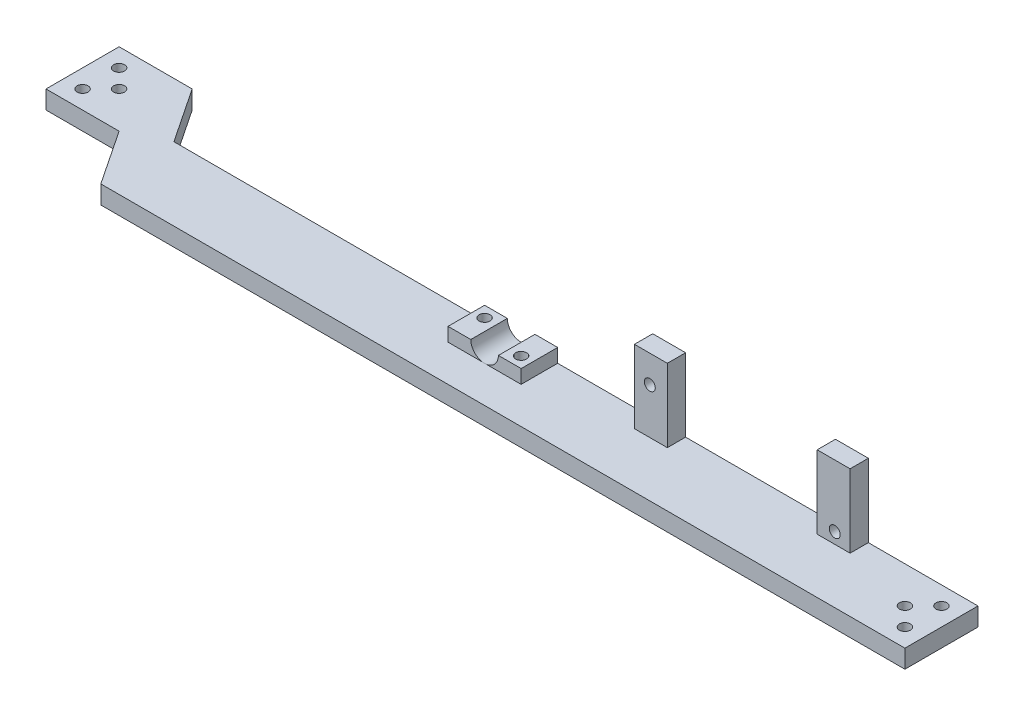
ISO-10303-21;
HEADER;
FILE_DESCRIPTION(('STEP AP214'),'2;1');
FILE_NAME('part.step','',(''),(''),'','','');
FILE_SCHEMA(('AUTOMOTIVE_DESIGN { 1 0 10303 214 1 1 1 1 }'));
ENDSEC;
DATA;
#1=APPLICATION_CONTEXT('core data for automotive mechanical design processes');
#2=APPLICATION_PROTOCOL_DEFINITION('international standard','automotive_design',2000,#1);
#3=PRODUCT_CONTEXT('',#1,'mechanical');
#4=PRODUCT('Part','Part','',(#3));
#5=PRODUCT_RELATED_PRODUCT_CATEGORY('part','',(#4));
#6=PRODUCT_DEFINITION_FORMATION('','',#4);
#7=PRODUCT_DEFINITION_CONTEXT('part definition',#1,'design');
#8=PRODUCT_DEFINITION('design','',#6,#7);
#9=PRODUCT_DEFINITION_SHAPE('','',#8);
#10=(LENGTH_UNIT() NAMED_UNIT(*) SI_UNIT(.MILLI.,.METRE.));
#11=(NAMED_UNIT(*) PLANE_ANGLE_UNIT() SI_UNIT($,.RADIAN.));
#12=(NAMED_UNIT(*) SI_UNIT($,.STERADIAN.) SOLID_ANGLE_UNIT());
#13=UNCERTAINTY_MEASURE_WITH_UNIT(LENGTH_MEASURE(1.E-05),#10,'distance_accuracy_value','');
#14=(GEOMETRIC_REPRESENTATION_CONTEXT(3) GLOBAL_UNCERTAINTY_ASSIGNED_CONTEXT((#13)) GLOBAL_UNIT_ASSIGNED_CONTEXT((#10,
#11,#12)) REPRESENTATION_CONTEXT('',''));
#15=CARTESIAN_POINT('',(0.,0.,0.));
#16=DIRECTION('',(0.,0.,1.));
#17=DIRECTION('',(1.,0.,0.));
#18=AXIS2_PLACEMENT_3D('',#15,#16,#17);
#19=CARTESIAN_POINT('',(0.,5.,0.));
#20=DIRECTION('',(0.,1.,0.));
#21=DIRECTION('',(0.,0.,1.));
#22=AXIS2_PLACEMENT_3D('',#19,#20,#21);
#23=PLANE('',#22);
#24=CARTESIAN_POINT('',(-46.3058300514676,5.,-18.37944916357));
#25=DIRECTION('',(0.,1.,0.));
#26=DIRECTION('',(0.,0.,1.));
#27=AXIS2_PLACEMENT_3D('',#24,#25,#26);
#28=CIRCLE('',#27,1.5);
#29=CARTESIAN_POINT('',(-46.3058300514676,5.,-16.87944916357));
#30=VERTEX_POINT('',#29);
#31=EDGE_CURVE('E255',#30,#30,#28,.T.);
#32=ORIENTED_EDGE('',*,*,#31,.F.);
#33=EDGE_LOOP('',(#32));
#34=FACE_BOUND('',#33,.T.);
#35=CARTESIAN_POINT('',(183.694169948532,5.,-3.37944916357003));
#36=DIRECTION('',(0.,1.,0.));
#37=DIRECTION('',(0.,0.,1.));
#38=AXIS2_PLACEMENT_3D('',#35,#36,#37);
#39=CIRCLE('',#38,1.5);
#40=CARTESIAN_POINT('',(183.694169948532,5.,-1.87944916357004));
#41=VERTEX_POINT('',#40);
#42=EDGE_CURVE('E261',#41,#41,#39,.T.);
#43=ORIENTED_EDGE('',*,*,#42,.F.);
#44=EDGE_LOOP('',(#43));
#45=FACE_BOUND('',#44,.T.);
#46=CARTESIAN_POINT('',(188.694169948532,5.,-8.37944916357003));
#47=DIRECTION('',(0.,1.,0.));
#48=DIRECTION('',(0.,0.,1.));
#49=AXIS2_PLACEMENT_3D('',#46,#47,#48);
#50=CIRCLE('',#49,1.5);
#51=CARTESIAN_POINT('',(188.694169948532,5.,-6.87944916357003));
#52=VERTEX_POINT('',#51);
#53=EDGE_CURVE('E267',#52,#52,#50,.T.);
#54=ORIENTED_EDGE('',*,*,#53,.F.);
#55=EDGE_LOOP('',(#54));
#56=FACE_BOUND('',#55,.T.);
#57=CARTESIAN_POINT('',(188.694169948532,5.,1.62055083642996));
#58=DIRECTION('',(0.,1.,0.));
#59=DIRECTION('',(0.,0.,1.));
#60=AXIS2_PLACEMENT_3D('',#57,#58,#59);
#61=CIRCLE('',#60,1.5);
#62=CARTESIAN_POINT('',(188.694169948532,5.,3.12055083642995));
#63=VERTEX_POINT('',#62);
#64=EDGE_CURVE('E273',#63,#63,#61,.T.);
#65=ORIENTED_EDGE('',*,*,#64,.F.);
#66=EDGE_LOOP('',(#65));
#67=FACE_BOUND('',#66,.T.);
#68=CARTESIAN_POINT('',(-51.3058300514676,5.,-13.37944916357));
#69=DIRECTION('',(0.,1.,0.));
#70=DIRECTION('',(0.,0.,1.));
#71=AXIS2_PLACEMENT_3D('',#68,#69,#70);
#72=CIRCLE('',#71,1.5);
#73=CARTESIAN_POINT('',(-51.3058300514676,5.,-11.87944916357));
#74=VERTEX_POINT('',#73);
#75=EDGE_CURVE('E279',#74,#74,#72,.T.);
#76=ORIENTED_EDGE('',*,*,#75,.F.);
#77=EDGE_LOOP('',(#76));
#78=FACE_BOUND('',#77,.T.);
#79=CARTESIAN_POINT('',(-51.3058300514676,5.,-23.37944916357));
#80=DIRECTION('',(0.,1.,0.));
#81=DIRECTION('',(0.,0.,1.));
#82=AXIS2_PLACEMENT_3D('',#79,#80,#81);
#83=CIRCLE('',#82,1.5);
#84=CARTESIAN_POINT('',(-51.3058300514676,5.,-21.87944916357));
#85=VERTEX_POINT('',#84);
#86=EDGE_CURVE('E285',#85,#85,#83,.T.);
#87=ORIENTED_EDGE('',*,*,#86,.F.);
#88=EDGE_LOOP('',(#87));
#89=FACE_BOUND('',#88,.T.);
#90=DIRECTION('',(1.,0.,0.));
#91=VECTOR('',#90,1.);
#92=CARTESIAN_POINT('',(154.694169948532,5.,-8.37944916357003));
#93=LINE('',#92,#91);
#94=CARTESIAN_POINT('',(154.694169948532,5.,-8.37944916357003));
#95=VERTEX_POINT('',#94);
#96=CARTESIAN_POINT('',(163.694169948532,5.,-8.37944916357003));
#97=VERTEX_POINT('',#96);
#98=EDGE_CURVE('E50',#95,#97,#93,.T.);
#99=ORIENTED_EDGE('',*,*,#98,.F.);
#100=DIRECTION('',(0.,0.,1.));
#101=VECTOR('',#100,1.);
#102=CARTESIAN_POINT('',(154.694169948532,5.,-8.37944916357003));
#103=LINE('',#102,#101);
#104=CARTESIAN_POINT('',(154.694169948532,5.,-13.37944916357));
#105=VERTEX_POINT('',#104);
#106=EDGE_CURVE('E209',#105,#95,#103,.T.);
#107=ORIENTED_EDGE('',*,*,#106,.F.);
#108=DIRECTION('',(-1.,0.,0.));
#109=VECTOR('',#108,1.);
#110=CARTESIAN_POINT('',(-26.3058300514676,5.,-13.37944916357));
#111=LINE('',#110,#109);
#112=CARTESIAN_POINT('',(113.694169948532,5.,-13.37944916357));
#113=VERTEX_POINT('',#112);
#114=EDGE_CURVE('E36',#105,#113,#111,.T.);
#115=ORIENTED_EDGE('',*,*,#114,.T.);
#116=DIRECTION('',(0.,0.,-1.));
#117=VECTOR('',#116,1.);
#118=CARTESIAN_POINT('',(113.694169948532,5.,-8.37944916357003));
#119=LINE('',#118,#117);
#120=CARTESIAN_POINT('',(113.694169948532,5.,-8.37944916357003));
#121=VERTEX_POINT('',#120);
#122=EDGE_CURVE('E223',#121,#113,#119,.T.);
#123=ORIENTED_EDGE('',*,*,#122,.F.);
#124=DIRECTION('',(1.,0.,0.));
#125=VECTOR('',#124,1.);
#126=CARTESIAN_POINT('',(104.694169948532,5.,-8.37944916357003));
#127=LINE('',#126,#125);
#128=CARTESIAN_POINT('',(104.694169948532,5.,-8.37944916357003));
#129=VERTEX_POINT('',#128);
#130=EDGE_CURVE('E213',#129,#121,#127,.T.);
#131=ORIENTED_EDGE('',*,*,#130,.F.);
#132=DIRECTION('',(0.,0.,1.));
#133=VECTOR('',#132,1.);
#134=CARTESIAN_POINT('',(104.694169948532,5.,-8.37944916357003));
#135=LINE('',#134,#133);
#136=CARTESIAN_POINT('',(104.694169948532,5.,-13.37944916357));
#137=VERTEX_POINT('',#136);
#138=EDGE_CURVE('E210',#137,#129,#135,.T.);
#139=ORIENTED_EDGE('',*,*,#138,.F.);
#140=CARTESIAN_POINT('',(78.6941699485324,5.,-13.37944916357));
#141=VERTEX_POINT('',#140);
#142=EDGE_CURVE('E338',#137,#141,#111,.T.);
#143=ORIENTED_EDGE('',*,*,#142,.T.);
#144=DIRECTION('',(0.,0.,-1.));
#145=VECTOR('',#144,1.);
#146=CARTESIAN_POINT('',(78.6941699485324,5.,-13.37944916357));
#147=LINE('',#146,#145);
#148=CARTESIAN_POINT('',(78.6941699485324,5.,-3.37944916357003));
#149=VERTEX_POINT('',#148);
#150=EDGE_CURVE('E307',#149,#141,#147,.T.);
#151=ORIENTED_EDGE('',*,*,#150,.F.);
#152=DIRECTION('',(1.,0.,0.));
#153=VECTOR('',#152,1.);
#154=CARTESIAN_POINT('',(58.6941699485324,5.,-3.37944916357003));
#155=LINE('',#154,#153);
#156=CARTESIAN_POINT('',(69.1279037378549,5.,-3.37944916357003));
#157=VERTEX_POINT('',#156);
#158=EDGE_CURVE('E321',#157,#149,#155,.T.);
#159=ORIENTED_EDGE('',*,*,#158,.F.);
#160=DIRECTION('',(1.,0.,0.));
#161=VECTOR('',#160,1.);
#162=CARTESIAN_POINT('',(0.,5.,-3.37944916357003));
#163=LINE('',#162,#161);
#164=CARTESIAN_POINT('',(68.2604361592099,5.,-3.37944916357003));
#165=VERTEX_POINT('',#164);
#166=EDGE_CURVE('E297',#165,#157,#163,.T.);
#167=ORIENTED_EDGE('',*,*,#166,.F.);
#168=CARTESIAN_POINT('',(58.6941699485324,5.,-3.37944916357003));
#169=VERTEX_POINT('',#168);
#170=EDGE_CURVE('E318',#169,#165,#155,.T.);
#171=ORIENTED_EDGE('',*,*,#170,.F.);
#172=DIRECTION('',(0.,0.,1.));
#173=VECTOR('',#172,1.);
#174=CARTESIAN_POINT('',(58.6941699485324,5.,-13.37944916357));
#175=LINE('',#174,#173);
#176=CARTESIAN_POINT('',(58.6941699485324,5.,-13.37944916357));
#177=VERTEX_POINT('',#176);
#178=EDGE_CURVE('E302',#177,#169,#175,.T.);
#179=ORIENTED_EDGE('',*,*,#178,.F.);
#180=CARTESIAN_POINT('',(-26.3058300514676,5.,-13.37944916357));
#181=VERTEX_POINT('',#180);
#182=EDGE_CURVE('E339',#177,#181,#111,.T.);
#183=ORIENTED_EDGE('',*,*,#182,.T.);
#184=DIRECTION('',(-0.554700196225231,0.,-0.832050294337843));
#185=VECTOR('',#184,1.);
#186=CARTESIAN_POINT('',(-36.3058300514676,5.,-28.37944916357));
#187=LINE('',#186,#185);
#188=CARTESIAN_POINT('',(-36.3058300514676,5.,-28.37944916357));
#189=VERTEX_POINT('',#188);
#190=EDGE_CURVE('E345',#181,#189,#187,.T.);
#191=ORIENTED_EDGE('',*,*,#190,.T.);
#192=DIRECTION('',(-1.,0.,0.));
#193=VECTOR('',#192,1.);
#194=CARTESIAN_POINT('',(-56.3058300514676,5.,-28.37944916357));
#195=LINE('',#194,#193);
#196=CARTESIAN_POINT('',(-56.3058300514676,5.,-28.37944916357));
#197=VERTEX_POINT('',#196);
#198=EDGE_CURVE('E378',#189,#197,#195,.T.);
#199=ORIENTED_EDGE('',*,*,#198,.T.);
#200=DIRECTION('',(0.,0.,1.));
#201=VECTOR('',#200,1.);
#202=CARTESIAN_POINT('',(-56.3058300514676,5.,-28.37944916357));
#203=LINE('',#202,#201);
#204=CARTESIAN_POINT('',(-56.3058300514676,5.,-8.37944916357003));
#205=VERTEX_POINT('',#204);
#206=EDGE_CURVE('E381',#197,#205,#203,.T.);
#207=ORIENTED_EDGE('',*,*,#206,.T.);
#208=DIRECTION('',(1.,0.,0.));
#209=VECTOR('',#208,1.);
#210=CARTESIAN_POINT('',(-56.3058300514676,5.,-8.37944916357003));
#211=LINE('',#210,#209);
#212=CARTESIAN_POINT('',(-36.3058300514676,5.,-8.37944916357003));
#213=VERTEX_POINT('',#212);
#214=EDGE_CURVE('E414',#205,#213,#211,.T.);
#215=ORIENTED_EDGE('',*,*,#214,.T.);
#216=DIRECTION('',(0.55470019622523,0.,0.832050294337843));
#217=VECTOR('',#216,1.);
#218=CARTESIAN_POINT('',(-36.3058300514676,5.,-8.37944916357003));
#219=LINE('',#218,#217);
#220=CARTESIAN_POINT('',(-26.3058300514676,5.,6.62055083642996));
#221=VERTEX_POINT('',#220);
#222=EDGE_CURVE('E416',#213,#221,#219,.T.);
#223=ORIENTED_EDGE('',*,*,#222,.T.);
#224=DIRECTION('',(1.,0.,0.));
#225=VECTOR('',#224,1.);
#226=CARTESIAN_POINT('',(-26.3058300514676,5.,6.62055083642996));
#227=LINE('',#226,#225);
#228=CARTESIAN_POINT('',(193.694169948532,5.,6.62055083642996));
#229=VERTEX_POINT('',#228);
#230=EDGE_CURVE('E419',#221,#229,#227,.T.);
#231=ORIENTED_EDGE('',*,*,#230,.T.);
#232=DIRECTION('',(0.,0.,-1.));
#233=VECTOR('',#232,1.);
#234=CARTESIAN_POINT('',(193.694169948532,5.,-13.37944916357));
#235=LINE('',#234,#233);
#236=CARTESIAN_POINT('',(193.694169948532,5.,-13.37944916357));
#237=VERTEX_POINT('',#236);
#238=EDGE_CURVE('E343',#229,#237,#235,.T.);
#239=ORIENTED_EDGE('',*,*,#238,.T.);
#240=CARTESIAN_POINT('',(163.694169948532,5.,-13.37944916357));
#241=VERTEX_POINT('',#240);
#242=EDGE_CURVE('E353',#237,#241,#111,.T.);
#243=ORIENTED_EDGE('',*,*,#242,.T.);
#244=DIRECTION('',(0.,0.,-1.));
#245=VECTOR('',#244,1.);
#246=CARTESIAN_POINT('',(163.694169948532,5.,-8.37944916357003));
#247=LINE('',#246,#245);
#248=EDGE_CURVE('E55',#97,#241,#247,.T.);
#249=ORIENTED_EDGE('',*,*,#248,.F.);
#250=EDGE_LOOP('',(#99,#107,#115,#123,#131,#139,#143,#151,#159,#167,#171,#179,#183,#191,#199,
#207,#215,#223,#231,#239,#243,#249));
#251=FACE_BOUND('',#250,.T.);
#252=ADVANCED_FACE('F32',(#34,#45,#56,#67,#78,#89,#251),#23,.T.);
#253=CARTESIAN_POINT('',(58.6941699485324,8.75,-3.37944916357003));
#254=DIRECTION('',(0.,0.,-1.));
#255=DIRECTION('',(-1.,0.,0.));
#256=AXIS2_PLACEMENT_3D('',#253,#254,#255);
#257=PLANE('',#256);
#258=DIRECTION('',(1.,0.,0.));
#259=VECTOR('',#258,1.);
#260=CARTESIAN_POINT('',(58.6941699485324,8.75,-3.37944916357003));
#261=LINE('',#260,#259);
#262=CARTESIAN_POINT('',(72.4691699485324,8.75,-3.37944916357003));
#263=VERTEX_POINT('',#262);
#264=CARTESIAN_POINT('',(78.6941699485324,8.75,-3.37944916357003));
#265=VERTEX_POINT('',#264);
#266=EDGE_CURVE('E306',#263,#265,#261,.T.);
#267=ORIENTED_EDGE('',*,*,#266,.F.);
#268=CARTESIAN_POINT('',(68.6941699485324,8.75,-3.37944916357003));
#269=DIRECTION('',(0.,0.,1.));
#270=DIRECTION('',(1.,0.,0.));
#271=AXIS2_PLACEMENT_3D('',#268,#269,#270);
#272=CIRCLE('',#271,3.775);
#273=EDGE_CURVE('E291',#157,#263,#272,.T.);
#274=ORIENTED_EDGE('',*,*,#273,.F.);
#275=ORIENTED_EDGE('',*,*,#158,.T.);
#276=DIRECTION('',(0.,-1.,0.));
#277=VECTOR('',#276,1.);
#278=CARTESIAN_POINT('',(78.6941699485324,8.75,-3.37944916357003));
#279=LINE('',#278,#277);
#280=EDGE_CURVE('E324',#265,#149,#279,.T.);
#281=ORIENTED_EDGE('',*,*,#280,.F.);
#282=EDGE_LOOP('',(#267,#274,#275,#281));
#283=FACE_BOUND('',#282,.T.);
#284=ADVANCED_FACE('F476',(#283),#257,.F.);
#285=CARTESIAN_POINT('',(0.,8.75,0.));
#286=DIRECTION('',(0.,1.,0.));
#287=DIRECTION('',(0.,0.,1.));
#288=AXIS2_PLACEMENT_3D('',#285,#286,#287);
#289=PLANE('',#288);
#290=CARTESIAN_POINT('',(61.6941699485324,8.75,-10.37944916357));
#291=DIRECTION('',(0.,1.,0.));
#292=DIRECTION('',(0.,0.,1.));
#293=AXIS2_PLACEMENT_3D('',#290,#291,#292);
#294=CIRCLE('',#293,1.49999999999998);
#295=CARTESIAN_POINT('',(61.6941699485324,8.75,-8.87944916357005));
#296=VERTEX_POINT('',#295);
#297=EDGE_CURVE('E245',#296,#296,#294,.T.);
#298=ORIENTED_EDGE('',*,*,#297,.F.);
#299=EDGE_LOOP('',(#298));
#300=FACE_BOUND('',#299,.T.);
#301=DIRECTION('',(0.,0.,1.));
#302=VECTOR('',#301,1.);
#303=CARTESIAN_POINT('',(64.9191699485324,8.75,-13.37944916357));
#304=LINE('',#303,#302);
#305=CARTESIAN_POINT('',(64.9191699485324,8.75,-13.37944916357));
#306=VERTEX_POINT('',#305);
#307=CARTESIAN_POINT('',(64.9191699485324,8.75,-3.37944916357003));
#308=VERTEX_POINT('',#307);
#309=EDGE_CURVE('E11',#306,#308,#304,.T.);
#310=ORIENTED_EDGE('',*,*,#309,.F.);
#311=DIRECTION('',(-1.,0.,0.));
#312=VECTOR('',#311,1.);
#313=CARTESIAN_POINT('',(58.6941699485324,8.75,-13.37944916357));
#314=LINE('',#313,#312);
#315=CARTESIAN_POINT('',(58.6941699485324,8.75,-13.37944916357));
#316=VERTEX_POINT('',#315);
#317=EDGE_CURVE('E313',#306,#316,#314,.T.);
#318=ORIENTED_EDGE('',*,*,#317,.T.);
#319=DIRECTION('',(0.,0.,1.));
#320=VECTOR('',#319,1.);
#321=CARTESIAN_POINT('',(58.6941699485324,8.75,-13.37944916357));
#322=LINE('',#321,#320);
#323=CARTESIAN_POINT('',(58.6941699485324,8.75,-3.37944916357003));
#324=VERTEX_POINT('',#323);
#325=EDGE_CURVE('E303',#316,#324,#322,.T.);
#326=ORIENTED_EDGE('',*,*,#325,.T.);
#327=EDGE_CURVE('E308',#324,#308,#261,.T.);
#328=ORIENTED_EDGE('',*,*,#327,.T.);
#329=EDGE_LOOP('',(#310,#318,#326,#328));
#330=FACE_BOUND('',#329,.T.);
#331=ADVANCED_FACE('F484',(#300,#330),#289,.T.);
#332=CARTESIAN_POINT('',(-56.3058300514676,5.,-28.37944916357));
#333=DIRECTION('',(1.,0.,0.));
#334=DIRECTION('',(0.,0.,-1.));
#335=AXIS2_PLACEMENT_3D('',#332,#333,#334);
#336=PLANE('',#335);
#337=DIRECTION('',(0.,0.,1.));
#338=VECTOR('',#337,1.);
#339=CARTESIAN_POINT('',(-56.3058300514676,0.,-28.37944916357));
#340=LINE('',#339,#338);
#341=CARTESIAN_POINT('',(-56.3058300514676,0.,-28.37944916357));
#342=VERTEX_POINT('',#341);
#343=CARTESIAN_POINT('',(-56.3058300514676,0.,-8.37944916357003));
#344=VERTEX_POINT('',#343);
#345=EDGE_CURVE('E394',#342,#344,#340,.T.);
#346=ORIENTED_EDGE('',*,*,#345,.T.);
#347=DIRECTION('',(0.,-1.,0.));
#348=VECTOR('',#347,1.);
#349=CARTESIAN_POINT('',(-56.3058300514676,5.,-8.37944916357003));
#350=LINE('',#349,#348);
#351=EDGE_CURVE('E337',#205,#344,#350,.T.);
#352=ORIENTED_EDGE('',*,*,#351,.F.);
#353=ORIENTED_EDGE('',*,*,#206,.F.);
#354=DIRECTION('',(0.,-1.,0.));
#355=VECTOR('',#354,1.);
#356=CARTESIAN_POINT('',(-56.3058300514676,5.,-28.37944916357));
#357=LINE('',#356,#355);
#358=EDGE_CURVE('E375',#197,#342,#357,.T.);
#359=ORIENTED_EDGE('',*,*,#358,.T.);
#360=EDGE_LOOP('',(#346,#352,#353,#359));
#361=FACE_BOUND('',#360,.T.);
#362=ADVANCED_FACE('F34',(#361),#336,.F.);
#363=CARTESIAN_POINT('',(-56.3058300514676,5.,-8.37944916357003));
#364=DIRECTION('',(0.,0.,-1.));
#365=DIRECTION('',(-1.,0.,0.));
#366=AXIS2_PLACEMENT_3D('',#363,#364,#365);
#367=PLANE('',#366);
#368=DIRECTION('',(1.,0.,0.));
#369=VECTOR('',#368,1.);
#370=CARTESIAN_POINT('',(-56.3058300514676,0.,-8.37944916357003));
#371=LINE('',#370,#369);
#372=CARTESIAN_POINT('',(-36.3058300514676,0.,-8.37944916357003));
#373=VERTEX_POINT('',#372);
#374=EDGE_CURVE('E392',#344,#373,#371,.T.);
#375=ORIENTED_EDGE('',*,*,#374,.T.);
#376=DIRECTION('',(0.,-1.,0.));
#377=VECTOR('',#376,1.);
#378=CARTESIAN_POINT('',(-36.3058300514676,5.,-8.37944916357003));
#379=LINE('',#378,#377);
#380=EDGE_CURVE('E357',#213,#373,#379,.T.);
#381=ORIENTED_EDGE('',*,*,#380,.F.);
#382=ORIENTED_EDGE('',*,*,#214,.F.);
#383=ORIENTED_EDGE('',*,*,#351,.T.);
#384=EDGE_LOOP('',(#375,#381,#382,#383));
#385=FACE_BOUND('',#384,.T.);
#386=ADVANCED_FACE('F511',(#385),#367,.F.);
#387=CARTESIAN_POINT('',(-36.3058300514676,5.,-8.37944916357003));
#388=DIRECTION('',(0.832050294337843,0.,-0.55470019622523));
#389=DIRECTION('',(-0.55470019622523,0.,-0.832050294337843));
#390=AXIS2_PLACEMENT_3D('',#387,#388,#389);
#391=PLANE('',#390);
#392=DIRECTION('',(0.55470019622523,0.,0.832050294337843));
#393=VECTOR('',#392,1.);
#394=CARTESIAN_POINT('',(-36.3058300514676,0.,-8.37944916357003));
#395=LINE('',#394,#393);
#396=CARTESIAN_POINT('',(-26.3058300514676,0.,6.62055083642996));
#397=VERTEX_POINT('',#396);
#398=EDGE_CURVE('E390',#373,#397,#395,.T.);
#399=ORIENTED_EDGE('',*,*,#398,.T.);
#400=DIRECTION('',(0.,-1.,0.));
#401=VECTOR('',#400,1.);
#402=CARTESIAN_POINT('',(-26.3058300514676,5.,6.62055083642996));
#403=LINE('',#402,#401);
#404=EDGE_CURVE('E360',#221,#397,#403,.T.);
#405=ORIENTED_EDGE('',*,*,#404,.F.);
#406=ORIENTED_EDGE('',*,*,#222,.F.);
#407=ORIENTED_EDGE('',*,*,#380,.T.);
#408=EDGE_LOOP('',(#399,#405,#406,#407));
#409=FACE_BOUND('',#408,.T.);
#410=ADVANCED_FACE('F508',(#409),#391,.F.);
#411=CARTESIAN_POINT('',(-26.3058300514676,5.,6.62055083642996));
#412=DIRECTION('',(0.,0.,-1.));
#413=DIRECTION('',(-1.,0.,0.));
#414=AXIS2_PLACEMENT_3D('',#411,#412,#413);
#415=PLANE('',#414);
#416=DIRECTION('',(1.,0.,0.));
#417=VECTOR('',#416,1.);
#418=CARTESIAN_POINT('',(-26.3058300514676,0.,6.62055083642996));
#419=LINE('',#418,#417);
#420=CARTESIAN_POINT('',(193.694169948532,0.,6.62055083642996));
#421=VERTEX_POINT('',#420);
#422=EDGE_CURVE('E388',#397,#421,#419,.T.);
#423=ORIENTED_EDGE('',*,*,#422,.T.);
#424=DIRECTION('',(0.,-1.,0.));
#425=VECTOR('',#424,1.);
#426=CARTESIAN_POINT('',(193.694169948532,5.,6.62055083642996));
#427=LINE('',#426,#425);
#428=EDGE_CURVE('E363',#229,#421,#427,.T.);
#429=ORIENTED_EDGE('',*,*,#428,.F.);
#430=ORIENTED_EDGE('',*,*,#230,.F.);
#431=ORIENTED_EDGE('',*,*,#404,.T.);
#432=EDGE_LOOP('',(#423,#429,#430,#431));
#433=FACE_BOUND('',#432,.T.);
#434=ADVANCED_FACE('F505',(#433),#415,.F.);
#435=CARTESIAN_POINT('',(193.694169948532,5.,-13.37944916357));
#436=DIRECTION('',(-1.,0.,0.));
#437=DIRECTION('',(0.,0.,1.));
#438=AXIS2_PLACEMENT_3D('',#435,#436,#437);
#439=PLANE('',#438);
#440=DIRECTION('',(0.,0.,-1.));
#441=VECTOR('',#440,1.);
#442=CARTESIAN_POINT('',(193.694169948532,0.,-13.37944916357));
#443=LINE('',#442,#441);
#444=CARTESIAN_POINT('',(193.694169948532,0.,-13.37944916357));
#445=VERTEX_POINT('',#444);
#446=EDGE_CURVE('E386',#421,#445,#443,.T.);
#447=ORIENTED_EDGE('',*,*,#446,.T.);
#448=DIRECTION('',(0.,-1.,0.));
#449=VECTOR('',#448,1.);
#450=CARTESIAN_POINT('',(193.694169948532,5.,-13.37944916357));
#451=LINE('',#450,#449);
#452=EDGE_CURVE('E366',#237,#445,#451,.T.);
#453=ORIENTED_EDGE('',*,*,#452,.F.);
#454=ORIENTED_EDGE('',*,*,#238,.F.);
#455=ORIENTED_EDGE('',*,*,#428,.T.);
#456=EDGE_LOOP('',(#447,#453,#454,#455));
#457=FACE_BOUND('',#456,.T.);
#458=ADVANCED_FACE('F426',(#457),#439,.F.);
#459=CARTESIAN_POINT('',(-26.3058300514676,5.,-13.37944916357));
#460=DIRECTION('',(0.,0.,1.));
#461=DIRECTION('',(1.,0.,0.));
#462=AXIS2_PLACEMENT_3D('',#459,#460,#461);
#463=PLANE('',#462);
#464=CARTESIAN_POINT('',(159.494169948532,8.,-13.37944916357));
#465=DIRECTION('',(0.,0.,1.));
#466=DIRECTION('',(1.,0.,0.));
#467=AXIS2_PLACEMENT_3D('',#464,#465,#466);
#468=CIRCLE('',#467,1.5);
#469=CARTESIAN_POINT('',(160.994169948532,8.,-13.37944916357));
#470=VERTEX_POINT('',#469);
#471=EDGE_CURVE('E447',#470,#470,#468,.T.);
#472=ORIENTED_EDGE('',*,*,#471,.T.);
#473=EDGE_LOOP('',(#472));
#474=FACE_BOUND('',#473,.T.);
#475=CARTESIAN_POINT('',(108.894169948532,17.5,-13.37944916357));
#476=DIRECTION('',(0.,0.,1.));
#477=DIRECTION('',(1.,0.,0.));
#478=AXIS2_PLACEMENT_3D('',#475,#476,#477);
#479=CIRCLE('',#478,1.5);
#480=CARTESIAN_POINT('',(110.394169948532,17.5,-13.37944916357));
#481=VERTEX_POINT('',#480);
#482=EDGE_CURVE('E441',#481,#481,#479,.T.);
#483=ORIENTED_EDGE('',*,*,#482,.T.);
#484=EDGE_LOOP('',(#483));
#485=FACE_BOUND('',#484,.T.);
#486=ORIENTED_EDGE('',*,*,#317,.F.);
#487=CARTESIAN_POINT('',(68.6941699485324,8.75,-13.37944916357));
#488=DIRECTION('',(0.,0.,1.));
#489=DIRECTION('',(1.,0.,0.));
#490=AXIS2_PLACEMENT_3D('',#487,#488,#489);
#491=CIRCLE('',#490,3.775);
#492=CARTESIAN_POINT('',(72.4691699485324,8.75,-13.37944916357));
#493=VERTEX_POINT('',#492);
#494=EDGE_CURVE('E294',#306,#493,#491,.T.);
#495=ORIENTED_EDGE('',*,*,#494,.T.);
#496=CARTESIAN_POINT('',(78.6941699485324,8.75,-13.37944916357));
#497=VERTEX_POINT('',#496);
#498=EDGE_CURVE('E314',#497,#493,#314,.T.);
#499=ORIENTED_EDGE('',*,*,#498,.F.);
#500=DIRECTION('',(0.,-1.,0.));
#501=VECTOR('',#500,1.);
#502=CARTESIAN_POINT('',(78.6941699485324,8.75,-13.37944916357));
#503=LINE('',#502,#501);
#504=EDGE_CURVE('E332',#497,#141,#503,.T.);
#505=ORIENTED_EDGE('',*,*,#504,.T.);
#506=ORIENTED_EDGE('',*,*,#142,.F.);
#507=DIRECTION('',(0.,-1.,0.));
#508=VECTOR('',#507,1.);
#509=CARTESIAN_POINT('',(104.694169948532,25.,-13.37944916357));
#510=LINE('',#509,#508);
#511=CARTESIAN_POINT('',(104.694169948532,25.,-13.37944916357));
#512=VERTEX_POINT('',#511);
#513=EDGE_CURVE('E228',#512,#137,#510,.T.);
#514=ORIENTED_EDGE('',*,*,#513,.F.);
#515=DIRECTION('',(-1.,0.,0.));
#516=VECTOR('',#515,1.);
#517=CARTESIAN_POINT('',(104.694169948532,25.,-13.37944916357));
#518=LINE('',#517,#516);
#519=CARTESIAN_POINT('',(113.694169948532,25.,-13.37944916357));
#520=VERTEX_POINT('',#519);
#521=EDGE_CURVE('E227',#520,#512,#518,.T.);
#522=ORIENTED_EDGE('',*,*,#521,.F.);
#523=DIRECTION('',(0.,-1.,0.));
#524=VECTOR('',#523,1.);
#525=CARTESIAN_POINT('',(113.694169948532,25.,-13.37944916357));
#526=LINE('',#525,#524);
#527=EDGE_CURVE('E236',#520,#113,#526,.T.);
#528=ORIENTED_EDGE('',*,*,#527,.T.);
#529=ORIENTED_EDGE('',*,*,#114,.F.);
#530=DIRECTION('',(0.,-1.,0.));
#531=VECTOR('',#530,1.);
#532=CARTESIAN_POINT('',(154.694169948532,25.,-13.37944916357));
#533=LINE('',#532,#531);
#534=CARTESIAN_POINT('',(154.694169948532,25.,-13.37944916357));
#535=VERTEX_POINT('',#534);
#536=EDGE_CURVE('E435',#535,#105,#533,.T.);
#537=ORIENTED_EDGE('',*,*,#536,.F.);
#538=DIRECTION('',(-1.,0.,0.));
#539=VECTOR('',#538,1.);
#540=CARTESIAN_POINT('',(154.694169948532,25.,-13.37944916357));
#541=LINE('',#540,#539);
#542=CARTESIAN_POINT('',(163.694169948532,25.,-13.37944916357));
#543=VERTEX_POINT('',#542);
#544=EDGE_CURVE('E203',#543,#535,#541,.T.);
#545=ORIENTED_EDGE('',*,*,#544,.F.);
#546=DIRECTION('',(0.,-1.,0.));
#547=VECTOR('',#546,1.);
#548=CARTESIAN_POINT('',(163.694169948532,25.,-13.37944916357));
#549=LINE('',#548,#547);
#550=EDGE_CURVE('E215',#543,#241,#549,.T.);
#551=ORIENTED_EDGE('',*,*,#550,.T.);
#552=ORIENTED_EDGE('',*,*,#242,.F.);
#553=ORIENTED_EDGE('',*,*,#452,.T.);
#554=DIRECTION('',(-1.,0.,0.));
#555=VECTOR('',#554,1.);
#556=CARTESIAN_POINT('',(-26.3058300514676,0.,-13.37944916357));
#557=LINE('',#556,#555);
#558=CARTESIAN_POINT('',(-26.3058300514676,0.,-13.37944916357));
#559=VERTEX_POINT('',#558);
#560=EDGE_CURVE('E384',#445,#559,#557,.T.);
#561=ORIENTED_EDGE('',*,*,#560,.T.);
#562=DIRECTION('',(0.,-1.,0.));
#563=VECTOR('',#562,1.);
#564=CARTESIAN_POINT('',(-26.3058300514676,5.,-13.37944916357));
#565=LINE('',#564,#563);
#566=EDGE_CURVE('E369',#181,#559,#565,.T.);
#567=ORIENTED_EDGE('',*,*,#566,.F.);
#568=ORIENTED_EDGE('',*,*,#182,.F.);
#569=DIRECTION('',(0.,-1.,0.));
#570=VECTOR('',#569,1.);
#571=CARTESIAN_POINT('',(58.6941699485324,8.75,-13.37944916357));
#572=LINE('',#571,#570);
#573=EDGE_CURVE('E317',#316,#177,#572,.T.);
#574=ORIENTED_EDGE('',*,*,#573,.F.);
#575=EDGE_LOOP('',(#486,#495,#499,#505,#506,#514,#522,#528,#529,#537,#545,#551,#552,#553,#561,
#567,#568,#574));
#576=FACE_BOUND('',#575,.T.);
#577=ADVANCED_FACE('F432',(#474,#485,#576),#463,.F.);
#578=CARTESIAN_POINT('',(-36.3058300514676,5.,-28.37944916357));
#579=DIRECTION('',(-0.832050294337843,0.,0.554700196225231));
#580=DIRECTION('',(0.554700196225231,0.,0.832050294337843));
#581=AXIS2_PLACEMENT_3D('',#578,#579,#580);
#582=PLANE('',#581);
#583=DIRECTION('',(-0.554700196225231,0.,-0.832050294337843));
#584=VECTOR('',#583,1.);
#585=CARTESIAN_POINT('',(-36.3058300514676,0.,-28.37944916357));
#586=LINE('',#585,#584);
#587=CARTESIAN_POINT('',(-36.3058300514676,0.,-28.37944916357));
#588=VERTEX_POINT('',#587);
#589=EDGE_CURVE('E382',#559,#588,#586,.T.);
#590=ORIENTED_EDGE('',*,*,#589,.T.);
#591=DIRECTION('',(0.,-1.,0.));
#592=VECTOR('',#591,1.);
#593=CARTESIAN_POINT('',(-36.3058300514676,5.,-28.37944916357));
#594=LINE('',#593,#592);
#595=EDGE_CURVE('E372',#189,#588,#594,.T.);
#596=ORIENTED_EDGE('',*,*,#595,.F.);
#597=ORIENTED_EDGE('',*,*,#190,.F.);
#598=ORIENTED_EDGE('',*,*,#566,.T.);
#599=EDGE_LOOP('',(#590,#596,#597,#598));
#600=FACE_BOUND('',#599,.T.);
#601=ADVANCED_FACE('F405',(#600),#582,.F.);
#602=CARTESIAN_POINT('',(-56.3058300514676,5.,-28.37944916357));
#603=DIRECTION('',(0.,0.,1.));
#604=DIRECTION('',(1.,0.,0.));
#605=AXIS2_PLACEMENT_3D('',#602,#603,#604);
#606=PLANE('',#605);
#607=DIRECTION('',(-1.,0.,0.));
#608=VECTOR('',#607,1.);
#609=CARTESIAN_POINT('',(-56.3058300514676,0.,-28.37944916357));
#610=LINE('',#609,#608);
#611=EDGE_CURVE('E379',#588,#342,#610,.T.);
#612=ORIENTED_EDGE('',*,*,#611,.T.);
#613=ORIENTED_EDGE('',*,*,#358,.F.);
#614=ORIENTED_EDGE('',*,*,#198,.F.);
#615=ORIENTED_EDGE('',*,*,#595,.T.);
#616=EDGE_LOOP('',(#612,#613,#614,#615));
#617=FACE_BOUND('',#616,.T.);
#618=ADVANCED_FACE('F409',(#617),#606,.F.);
#619=CARTESIAN_POINT('',(0.,0.,0.));
#620=DIRECTION('',(0.,1.,0.));
#621=DIRECTION('',(0.,0.,1.));
#622=AXIS2_PLACEMENT_3D('',#619,#620,#621);
#623=PLANE('',#622);
#624=CARTESIAN_POINT('',(-46.3058300514676,0.,-18.37944916357));
#625=DIRECTION('',(0.,1.,0.));
#626=DIRECTION('',(0.,0.,1.));
#627=AXIS2_PLACEMENT_3D('',#624,#625,#626);
#628=CIRCLE('',#627,1.5);
#629=CARTESIAN_POINT('',(-46.3058300514676,0.,-16.87944916357));
#630=VERTEX_POINT('',#629);
#631=EDGE_CURVE('E258',#630,#630,#628,.T.);
#632=ORIENTED_EDGE('',*,*,#631,.T.);
#633=EDGE_LOOP('',(#632));
#634=FACE_BOUND('',#633,.T.);
#635=CARTESIAN_POINT('',(183.694169948532,0.,-3.37944916357003));
#636=DIRECTION('',(0.,1.,0.));
#637=DIRECTION('',(0.,0.,1.));
#638=AXIS2_PLACEMENT_3D('',#635,#636,#637);
#639=CIRCLE('',#638,1.5);
#640=CARTESIAN_POINT('',(183.694169948532,0.,-1.87944916357004));
#641=VERTEX_POINT('',#640);
#642=EDGE_CURVE('E264',#641,#641,#639,.T.);
#643=ORIENTED_EDGE('',*,*,#642,.T.);
#644=EDGE_LOOP('',(#643));
#645=FACE_BOUND('',#644,.T.);
#646=CARTESIAN_POINT('',(188.694169948532,0.,-8.37944916357003));
#647=DIRECTION('',(0.,1.,0.));
#648=DIRECTION('',(0.,0.,1.));
#649=AXIS2_PLACEMENT_3D('',#646,#647,#648);
#650=CIRCLE('',#649,1.5);
#651=CARTESIAN_POINT('',(188.694169948532,0.,-6.87944916357003));
#652=VERTEX_POINT('',#651);
#653=EDGE_CURVE('E270',#652,#652,#650,.T.);
#654=ORIENTED_EDGE('',*,*,#653,.T.);
#655=EDGE_LOOP('',(#654));
#656=FACE_BOUND('',#655,.T.);
#657=CARTESIAN_POINT('',(188.694169948532,0.,1.62055083642996));
#658=DIRECTION('',(0.,1.,0.));
#659=DIRECTION('',(0.,0.,1.));
#660=AXIS2_PLACEMENT_3D('',#657,#658,#659);
#661=CIRCLE('',#660,1.5);
#662=CARTESIAN_POINT('',(188.694169948532,0.,3.12055083642995));
#663=VERTEX_POINT('',#662);
#664=EDGE_CURVE('E276',#663,#663,#661,.T.);
#665=ORIENTED_EDGE('',*,*,#664,.T.);
#666=EDGE_LOOP('',(#665));
#667=FACE_BOUND('',#666,.T.);
#668=CARTESIAN_POINT('',(-51.3058300514676,0.,-13.37944916357));
#669=DIRECTION('',(0.,1.,0.));
#670=DIRECTION('',(0.,0.,1.));
#671=AXIS2_PLACEMENT_3D('',#668,#669,#670);
#672=CIRCLE('',#671,1.5);
#673=CARTESIAN_POINT('',(-51.3058300514676,0.,-11.87944916357));
#674=VERTEX_POINT('',#673);
#675=EDGE_CURVE('E282',#674,#674,#672,.T.);
#676=ORIENTED_EDGE('',*,*,#675,.T.);
#677=EDGE_LOOP('',(#676));
#678=FACE_BOUND('',#677,.T.);
#679=CARTESIAN_POINT('',(-51.3058300514676,0.,-23.37944916357));
#680=DIRECTION('',(0.,1.,0.));
#681=DIRECTION('',(0.,0.,1.));
#682=AXIS2_PLACEMENT_3D('',#679,#680,#681);
#683=CIRCLE('',#682,1.5);
#684=CARTESIAN_POINT('',(-51.3058300514676,0.,-21.87944916357));
#685=VERTEX_POINT('',#684);
#686=EDGE_CURVE('E288',#685,#685,#683,.T.);
#687=ORIENTED_EDGE('',*,*,#686,.T.);
#688=EDGE_LOOP('',(#687));
#689=FACE_BOUND('',#688,.T.);
#690=ORIENTED_EDGE('',*,*,#345,.F.);
#691=ORIENTED_EDGE('',*,*,#611,.F.);
#692=ORIENTED_EDGE('',*,*,#589,.F.);
#693=ORIENTED_EDGE('',*,*,#560,.F.);
#694=ORIENTED_EDGE('',*,*,#446,.F.);
#695=ORIENTED_EDGE('',*,*,#422,.F.);
#696=ORIENTED_EDGE('',*,*,#398,.F.);
#697=ORIENTED_EDGE('',*,*,#374,.F.);
#698=EDGE_LOOP('',(#690,#691,#692,#693,#694,#695,#696,#697));
#699=FACE_BOUND('',#698,.T.);
#700=ADVANCED_FACE('F493',(#634,#645,#656,#667,#678,#689,#699),#623,.F.);
#701=CARTESIAN_POINT('',(58.6941699485324,8.75,-13.37944916357));
#702=DIRECTION('',(1.,0.,0.));
#703=DIRECTION('',(0.,0.,-1.));
#704=AXIS2_PLACEMENT_3D('',#701,#702,#703);
#705=PLANE('',#704);
#706=ORIENTED_EDGE('',*,*,#178,.T.);
#707=DIRECTION('',(0.,-1.,0.));
#708=VECTOR('',#707,1.);
#709=CARTESIAN_POINT('',(58.6941699485324,8.75,-3.37944916357003));
#710=LINE('',#709,#708);
#711=EDGE_CURVE('E396',#324,#169,#710,.T.);
#712=ORIENTED_EDGE('',*,*,#711,.F.);
#713=ORIENTED_EDGE('',*,*,#325,.F.);
#714=ORIENTED_EDGE('',*,*,#573,.T.);
#715=EDGE_LOOP('',(#706,#712,#713,#714));
#716=FACE_BOUND('',#715,.T.);
#717=ADVANCED_FACE('F492',(#716),#705,.F.);
#718=ORIENTED_EDGE('',*,*,#170,.T.);
#719=EDGE_CURVE('E298',#308,#165,#272,.T.);
#720=ORIENTED_EDGE('',*,*,#719,.F.);
#721=ORIENTED_EDGE('',*,*,#327,.F.);
#722=ORIENTED_EDGE('',*,*,#711,.T.);
#723=EDGE_LOOP('',(#718,#720,#721,#722));
#724=FACE_BOUND('',#723,.T.);
#725=ADVANCED_FACE('F487',(#724),#257,.F.);
#726=CARTESIAN_POINT('',(78.6941699485324,8.75,-13.37944916357));
#727=DIRECTION('',(-1.,0.,0.));
#728=DIRECTION('',(0.,0.,1.));
#729=AXIS2_PLACEMENT_3D('',#726,#727,#728);
#730=PLANE('',#729);
#731=ORIENTED_EDGE('',*,*,#150,.T.);
#732=ORIENTED_EDGE('',*,*,#504,.F.);
#733=DIRECTION('',(0.,0.,-1.));
#734=VECTOR('',#733,1.);
#735=CARTESIAN_POINT('',(78.6941699485324,8.75,-13.37944916357));
#736=LINE('',#735,#734);
#737=EDGE_CURVE('E311',#265,#497,#736,.T.);
#738=ORIENTED_EDGE('',*,*,#737,.F.);
#739=ORIENTED_EDGE('',*,*,#280,.T.);
#740=EDGE_LOOP('',(#731,#732,#738,#739));
#741=FACE_BOUND('',#740,.T.);
#742=ADVANCED_FACE('F543',(#741),#730,.F.);
#743=CARTESIAN_POINT('',(75.6941699485324,8.75,-6.37944916357003));
#744=DIRECTION('',(0.,1.,0.));
#745=DIRECTION('',(0.,0.,1.));
#746=AXIS2_PLACEMENT_3D('',#743,#744,#745);
#747=CIRCLE('',#746,1.5);
#748=CARTESIAN_POINT('',(75.6941699485324,8.75,-4.87944916357004));
#749=VERTEX_POINT('',#748);
#750=EDGE_CURVE('E249',#749,#749,#747,.T.);
#751=ORIENTED_EDGE('',*,*,#750,.F.);
#752=EDGE_LOOP('',(#751));
#753=FACE_BOUND('',#752,.T.);
#754=DIRECTION('',(0.,0.,1.));
#755=VECTOR('',#754,1.);
#756=CARTESIAN_POINT('',(72.4691699485324,8.75,-13.37944916357));
#757=LINE('',#756,#755);
#758=EDGE_CURVE('E42',#263,#493,#757,.F.);
#759=ORIENTED_EDGE('',*,*,#758,.F.);
#760=ORIENTED_EDGE('',*,*,#266,.T.);
#761=ORIENTED_EDGE('',*,*,#737,.T.);
#762=ORIENTED_EDGE('',*,*,#498,.T.);
#763=EDGE_LOOP('',(#759,#760,#761,#762));
#764=FACE_BOUND('',#763,.T.);
#765=ADVANCED_FACE('F554',(#753,#764),#289,.T.);
#766=CARTESIAN_POINT('',(68.6941699485324,8.75,-13.37944916357));
#767=DIRECTION('',(0.,0.,1.));
#768=DIRECTION('',(1.,0.,0.));
#769=AXIS2_PLACEMENT_3D('',#766,#767,#768);
#770=CYLINDRICAL_SURFACE('',#769,3.775);
#771=ORIENTED_EDGE('',*,*,#309,.T.);
#772=ORIENTED_EDGE('',*,*,#719,.T.);
#773=EDGE_CURVE('E300',#165,#157,#272,.T.);
#774=ORIENTED_EDGE('',*,*,#773,.T.);
#775=ORIENTED_EDGE('',*,*,#273,.T.);
#776=ORIENTED_EDGE('',*,*,#758,.T.);
#777=ORIENTED_EDGE('',*,*,#494,.F.);
#778=EDGE_LOOP('',(#771,#772,#774,#775,#776,#777));
#779=FACE_BOUND('',#778,.T.);
#780=ADVANCED_FACE('F624',(#779),#770,.F.);
#781=CARTESIAN_POINT('',(68.6941699485324,8.75,-3.37944916357003));
#782=DIRECTION('',(0.,0.,1.));
#783=DIRECTION('',(1.,0.,0.));
#784=AXIS2_PLACEMENT_3D('',#781,#782,#783);
#785=PLANE('',#784);
#786=ORIENTED_EDGE('',*,*,#166,.T.);
#787=ORIENTED_EDGE('',*,*,#773,.F.);
#788=EDGE_LOOP('',(#786,#787));
#789=FACE_BOUND('',#788,.T.);
#790=ADVANCED_FACE('F620',(#789),#785,.F.);
#791=CARTESIAN_POINT('',(-51.3058300514676,0.,-23.37944916357));
#792=DIRECTION('',(0.,1.,0.));
#793=DIRECTION('',(0.,0.,1.));
#794=AXIS2_PLACEMENT_3D('',#791,#792,#793);
#795=CYLINDRICAL_SURFACE('',#794,1.5);
#796=ORIENTED_EDGE('',*,*,#686,.F.);
#797=EDGE_LOOP('',(#796));
#798=FACE_BOUND('',#797,.T.);
#799=ORIENTED_EDGE('',*,*,#86,.T.);
#800=EDGE_LOOP('',(#799));
#801=FACE_BOUND('',#800,.T.);
#802=ADVANCED_FACE('F616',(#798,#801),#795,.F.);
#803=CARTESIAN_POINT('',(-51.3058300514676,0.,-13.37944916357));
#804=DIRECTION('',(0.,1.,0.));
#805=DIRECTION('',(0.,0.,1.));
#806=AXIS2_PLACEMENT_3D('',#803,#804,#805);
#807=CYLINDRICAL_SURFACE('',#806,1.5);
#808=ORIENTED_EDGE('',*,*,#675,.F.);
#809=EDGE_LOOP('',(#808));
#810=FACE_BOUND('',#809,.T.);
#811=ORIENTED_EDGE('',*,*,#75,.T.);
#812=EDGE_LOOP('',(#811));
#813=FACE_BOUND('',#812,.T.);
#814=ADVANCED_FACE('F612',(#810,#813),#807,.F.);
#815=CARTESIAN_POINT('',(188.694169948532,0.,1.62055083642996));
#816=DIRECTION('',(0.,1.,0.));
#817=DIRECTION('',(0.,0.,1.));
#818=AXIS2_PLACEMENT_3D('',#815,#816,#817);
#819=CYLINDRICAL_SURFACE('',#818,1.5);
#820=ORIENTED_EDGE('',*,*,#664,.F.);
#821=EDGE_LOOP('',(#820));
#822=FACE_BOUND('',#821,.T.);
#823=ORIENTED_EDGE('',*,*,#64,.T.);
#824=EDGE_LOOP('',(#823));
#825=FACE_BOUND('',#824,.T.);
#826=ADVANCED_FACE('F608',(#822,#825),#819,.F.);
#827=CARTESIAN_POINT('',(188.694169948532,0.,-8.37944916357003));
#828=DIRECTION('',(0.,1.,0.));
#829=DIRECTION('',(0.,0.,1.));
#830=AXIS2_PLACEMENT_3D('',#827,#828,#829);
#831=CYLINDRICAL_SURFACE('',#830,1.5);
#832=ORIENTED_EDGE('',*,*,#653,.F.);
#833=EDGE_LOOP('',(#832));
#834=FACE_BOUND('',#833,.T.);
#835=ORIENTED_EDGE('',*,*,#53,.T.);
#836=EDGE_LOOP('',(#835));
#837=FACE_BOUND('',#836,.T.);
#838=ADVANCED_FACE('F604',(#834,#837),#831,.F.);
#839=CARTESIAN_POINT('',(183.694169948532,0.,-3.37944916357003));
#840=DIRECTION('',(0.,1.,0.));
#841=DIRECTION('',(0.,0.,1.));
#842=AXIS2_PLACEMENT_3D('',#839,#840,#841);
#843=CYLINDRICAL_SURFACE('',#842,1.5);
#844=ORIENTED_EDGE('',*,*,#642,.F.);
#845=EDGE_LOOP('',(#844));
#846=FACE_BOUND('',#845,.T.);
#847=ORIENTED_EDGE('',*,*,#42,.T.);
#848=EDGE_LOOP('',(#847));
#849=FACE_BOUND('',#848,.T.);
#850=ADVANCED_FACE('F600',(#846,#849),#843,.F.);
#851=CARTESIAN_POINT('',(-46.3058300514676,0.,-18.37944916357));
#852=DIRECTION('',(0.,1.,0.));
#853=DIRECTION('',(0.,0.,1.));
#854=AXIS2_PLACEMENT_3D('',#851,#852,#853);
#855=CYLINDRICAL_SURFACE('',#854,1.5);
#856=ORIENTED_EDGE('',*,*,#631,.F.);
#857=EDGE_LOOP('',(#856));
#858=FACE_BOUND('',#857,.T.);
#859=ORIENTED_EDGE('',*,*,#31,.T.);
#860=EDGE_LOOP('',(#859));
#861=FACE_BOUND('',#860,.T.);
#862=ADVANCED_FACE('F596',(#858,#861),#855,.F.);
#863=CARTESIAN_POINT('',(75.6941699485324,4.75,-6.37944916357003));
#864=DIRECTION('',(0.,1.,0.));
#865=DIRECTION('',(0.,0.,1.));
#866=AXIS2_PLACEMENT_3D('',#863,#864,#865);
#867=CYLINDRICAL_SURFACE('',#866,1.5);
#868=CARTESIAN_POINT('',(75.6941699485324,4.75,-6.37944916357003));
#869=DIRECTION('',(0.,1.,0.));
#870=DIRECTION('',(0.,0.,1.));
#871=AXIS2_PLACEMENT_3D('',#868,#869,#870);
#872=CIRCLE('',#871,1.5);
#873=CARTESIAN_POINT('',(75.6941699485324,4.75,-4.87944916357004));
#874=VERTEX_POINT('',#873);
#875=EDGE_CURVE('E252',#874,#874,#872,.T.);
#876=ORIENTED_EDGE('',*,*,#875,.F.);
#877=EDGE_LOOP('',(#876));
#878=FACE_BOUND('',#877,.T.);
#879=ORIENTED_EDGE('',*,*,#750,.T.);
#880=EDGE_LOOP('',(#879));
#881=FACE_BOUND('',#880,.T.);
#882=ADVANCED_FACE('F592',(#878,#881),#867,.F.);
#883=CARTESIAN_POINT('',(75.6941699485324,4.75,-6.37944916357003));
#884=DIRECTION('',(0.,1.,0.));
#885=DIRECTION('',(0.,0.,1.));
#886=AXIS2_PLACEMENT_3D('',#883,#884,#885);
#887=PLANE('',#886);
#888=ORIENTED_EDGE('',*,*,#875,.T.);
#889=EDGE_LOOP('',(#888));
#890=FACE_BOUND('',#889,.T.);
#891=ADVANCED_FACE('F588',(#890),#887,.T.);
#892=CARTESIAN_POINT('',(61.6941699485324,4.75,-10.37944916357));
#893=DIRECTION('',(0.,1.,0.));
#894=DIRECTION('',(0.,0.,1.));
#895=AXIS2_PLACEMENT_3D('',#892,#893,#894);
#896=CYLINDRICAL_SURFACE('',#895,1.49999999999998);
#897=CARTESIAN_POINT('',(61.6941699485324,4.75,-10.37944916357));
#898=DIRECTION('',(0.,1.,0.));
#899=DIRECTION('',(0.,0.,1.));
#900=AXIS2_PLACEMENT_3D('',#897,#898,#899);
#901=CIRCLE('',#900,1.49999999999998);
#902=CARTESIAN_POINT('',(61.6941699485324,4.75,-8.87944916357005));
#903=VERTEX_POINT('',#902);
#904=EDGE_CURVE('E246',#903,#903,#901,.T.);
#905=ORIENTED_EDGE('',*,*,#904,.F.);
#906=EDGE_LOOP('',(#905));
#907=FACE_BOUND('',#906,.T.);
#908=ORIENTED_EDGE('',*,*,#297,.T.);
#909=EDGE_LOOP('',(#908));
#910=FACE_BOUND('',#909,.T.);
#911=ADVANCED_FACE('F584',(#907,#910),#896,.F.);
#912=CARTESIAN_POINT('',(61.6941699485324,4.75,-10.37944916357));
#913=DIRECTION('',(0.,1.,0.));
#914=DIRECTION('',(0.,0.,1.));
#915=AXIS2_PLACEMENT_3D('',#912,#913,#914);
#916=PLANE('',#915);
#917=ORIENTED_EDGE('',*,*,#904,.T.);
#918=EDGE_LOOP('',(#917));
#919=FACE_BOUND('',#918,.T.);
#920=ADVANCED_FACE('F577',(#919),#916,.T.);
#921=CARTESIAN_POINT('',(104.694169948532,25.,-8.37944916357003));
#922=DIRECTION('',(1.,0.,0.));
#923=DIRECTION('',(0.,0.,-1.));
#924=AXIS2_PLACEMENT_3D('',#921,#922,#923);
#925=PLANE('',#924);
#926=ORIENTED_EDGE('',*,*,#138,.T.);
#927=DIRECTION('',(0.,-1.,0.));
#928=VECTOR('',#927,1.);
#929=CARTESIAN_POINT('',(104.694169948532,25.,-8.37944916357003));
#930=LINE('',#929,#928);
#931=CARTESIAN_POINT('',(104.694169948532,25.,-8.37944916357003));
#932=VERTEX_POINT('',#931);
#933=EDGE_CURVE('E242',#932,#129,#930,.T.);
#934=ORIENTED_EDGE('',*,*,#933,.F.);
#935=DIRECTION('',(0.,0.,1.));
#936=VECTOR('',#935,1.);
#937=CARTESIAN_POINT('',(104.694169948532,25.,-8.37944916357003));
#938=LINE('',#937,#936);
#939=EDGE_CURVE('E219',#512,#932,#938,.T.);
#940=ORIENTED_EDGE('',*,*,#939,.F.);
#941=ORIENTED_EDGE('',*,*,#513,.T.);
#942=EDGE_LOOP('',(#926,#934,#940,#941));
#943=FACE_BOUND('',#942,.T.);
#944=ADVANCED_FACE('F560',(#943),#925,.F.);
#945=CARTESIAN_POINT('',(104.694169948532,25.,-8.37944916357003));
#946=DIRECTION('',(0.,0.,-1.));
#947=DIRECTION('',(-1.,0.,0.));
#948=AXIS2_PLACEMENT_3D('',#945,#946,#947);
#949=PLANE('',#948);
#950=CARTESIAN_POINT('',(108.894169948532,17.5,-8.37944916357003));
#951=DIRECTION('',(0.,0.,1.));
#952=DIRECTION('',(1.,0.,0.));
#953=AXIS2_PLACEMENT_3D('',#950,#951,#952);
#954=CIRCLE('',#953,1.5);
#955=CARTESIAN_POINT('',(110.394169948532,17.5,-8.37944916357003));
#956=VERTEX_POINT('',#955);
#957=EDGE_CURVE('E444',#956,#956,#954,.T.);
#958=ORIENTED_EDGE('',*,*,#957,.F.);
#959=EDGE_LOOP('',(#958));
#960=FACE_BOUND('',#959,.T.);
#961=ORIENTED_EDGE('',*,*,#130,.T.);
#962=DIRECTION('',(0.,-1.,0.));
#963=VECTOR('',#962,1.);
#964=CARTESIAN_POINT('',(113.694169948532,25.,-8.37944916357003));
#965=LINE('',#964,#963);
#966=CARTESIAN_POINT('',(113.694169948532,25.,-8.37944916357003));
#967=VERTEX_POINT('',#966);
#968=EDGE_CURVE('E239',#967,#121,#965,.T.);
#969=ORIENTED_EDGE('',*,*,#968,.F.);
#970=DIRECTION('',(1.,0.,0.));
#971=VECTOR('',#970,1.);
#972=CARTESIAN_POINT('',(104.694169948532,25.,-8.37944916357003));
#973=LINE('',#972,#971);
#974=EDGE_CURVE('E222',#932,#967,#973,.T.);
#975=ORIENTED_EDGE('',*,*,#974,.F.);
#976=ORIENTED_EDGE('',*,*,#933,.T.);
#977=EDGE_LOOP('',(#961,#969,#975,#976));
#978=FACE_BOUND('',#977,.T.);
#979=ADVANCED_FACE('F568',(#960,#978),#949,.F.);
#980=CARTESIAN_POINT('',(113.694169948532,25.,-8.37944916357003));
#981=DIRECTION('',(-1.,0.,0.));
#982=DIRECTION('',(0.,0.,1.));
#983=AXIS2_PLACEMENT_3D('',#980,#981,#982);
#984=PLANE('',#983);
#985=ORIENTED_EDGE('',*,*,#122,.T.);
#986=ORIENTED_EDGE('',*,*,#527,.F.);
#987=DIRECTION('',(0.,0.,-1.));
#988=VECTOR('',#987,1.);
#989=CARTESIAN_POINT('',(113.694169948532,25.,-8.37944916357003));
#990=LINE('',#989,#988);
#991=EDGE_CURVE('E225',#967,#520,#990,.T.);
#992=ORIENTED_EDGE('',*,*,#991,.F.);
#993=ORIENTED_EDGE('',*,*,#968,.T.);
#994=EDGE_LOOP('',(#985,#986,#992,#993));
#995=FACE_BOUND('',#994,.T.);
#996=ADVANCED_FACE('F566',(#995),#984,.F.);
#997=CARTESIAN_POINT('',(0.,25.,0.));
#998=DIRECTION('',(0.,-1.,0.));
#999=DIRECTION('',(0.,0.,-1.));
#1000=AXIS2_PLACEMENT_3D('',#997,#998,#999);
#1001=PLANE('',#1000);
#1002=ORIENTED_EDGE('',*,*,#939,.T.);
#1003=ORIENTED_EDGE('',*,*,#974,.T.);
#1004=ORIENTED_EDGE('',*,*,#991,.T.);
#1005=ORIENTED_EDGE('',*,*,#521,.T.);
#1006=EDGE_LOOP('',(#1002,#1003,#1004,#1005));
#1007=FACE_BOUND('',#1006,.T.);
#1008=ADVANCED_FACE('F473',(#1007),#1001,.F.);
#1009=CARTESIAN_POINT('',(154.694169948532,25.,-8.37944916357003));
#1010=DIRECTION('',(1.,0.,0.));
#1011=DIRECTION('',(0.,0.,-1.));
#1012=AXIS2_PLACEMENT_3D('',#1009,#1010,#1011);
#1013=PLANE('',#1012);
#1014=ORIENTED_EDGE('',*,*,#106,.T.);
#1015=DIRECTION('',(0.,-1.,0.));
#1016=VECTOR('',#1015,1.);
#1017=CARTESIAN_POINT('',(154.694169948532,25.,-8.37944916357003));
#1018=LINE('',#1017,#1016);
#1019=CARTESIAN_POINT('',(154.694169948532,25.,-8.37944916357003));
#1020=VERTEX_POINT('',#1019);
#1021=EDGE_CURVE('E191',#1020,#95,#1018,.T.);
#1022=ORIENTED_EDGE('',*,*,#1021,.F.);
#1023=DIRECTION('',(0.,0.,1.));
#1024=VECTOR('',#1023,1.);
#1025=CARTESIAN_POINT('',(154.694169948532,25.,-8.37944916357003));
#1026=LINE('',#1025,#1024);
#1027=EDGE_CURVE('E198',#535,#1020,#1026,.T.);
#1028=ORIENTED_EDGE('',*,*,#1027,.F.);
#1029=ORIENTED_EDGE('',*,*,#536,.T.);
#1030=EDGE_LOOP('',(#1014,#1022,#1028,#1029));
#1031=FACE_BOUND('',#1030,.T.);
#1032=ADVANCED_FACE('F208',(#1031),#1013,.F.);
#1033=CARTESIAN_POINT('',(154.694169948532,25.,-8.37944916357003));
#1034=DIRECTION('',(0.,0.,-1.));
#1035=DIRECTION('',(-1.,0.,0.));
#1036=AXIS2_PLACEMENT_3D('',#1033,#1034,#1035);
#1037=PLANE('',#1036);
#1038=CARTESIAN_POINT('',(159.494169948532,8.,-8.37944916357003));
#1039=DIRECTION('',(0.,0.,1.));
#1040=DIRECTION('',(1.,0.,0.));
#1041=AXIS2_PLACEMENT_3D('',#1038,#1039,#1040);
#1042=CIRCLE('',#1041,1.5);
#1043=CARTESIAN_POINT('',(160.994169948532,8.,-8.37944916357003));
#1044=VERTEX_POINT('',#1043);
#1045=EDGE_CURVE('E450',#1044,#1044,#1042,.T.);
#1046=ORIENTED_EDGE('',*,*,#1045,.F.);
#1047=EDGE_LOOP('',(#1046));
#1048=FACE_BOUND('',#1047,.T.);
#1049=ORIENTED_EDGE('',*,*,#98,.T.);
#1050=DIRECTION('',(0.,-1.,0.));
#1051=VECTOR('',#1050,1.);
#1052=CARTESIAN_POINT('',(163.694169948532,25.,-8.37944916357003));
#1053=LINE('',#1052,#1051);
#1054=CARTESIAN_POINT('',(163.694169948532,25.,-8.37944916357003));
#1055=VERTEX_POINT('',#1054);
#1056=EDGE_CURVE('E194',#1055,#97,#1053,.T.);
#1057=ORIENTED_EDGE('',*,*,#1056,.F.);
#1058=DIRECTION('',(1.,0.,0.));
#1059=VECTOR('',#1058,1.);
#1060=CARTESIAN_POINT('',(154.694169948532,25.,-8.37944916357003));
#1061=LINE('',#1060,#1059);
#1062=EDGE_CURVE('E187',#1020,#1055,#1061,.T.);
#1063=ORIENTED_EDGE('',*,*,#1062,.F.);
#1064=ORIENTED_EDGE('',*,*,#1021,.T.);
#1065=EDGE_LOOP('',(#1049,#1057,#1063,#1064));
#1066=FACE_BOUND('',#1065,.T.);
#1067=ADVANCED_FACE('F189',(#1048,#1066),#1037,.F.);
#1068=CARTESIAN_POINT('',(163.694169948532,25.,-8.37944916357003));
#1069=DIRECTION('',(-1.,0.,0.));
#1070=DIRECTION('',(0.,0.,1.));
#1071=AXIS2_PLACEMENT_3D('',#1068,#1069,#1070);
#1072=PLANE('',#1071);
#1073=ORIENTED_EDGE('',*,*,#248,.T.);
#1074=ORIENTED_EDGE('',*,*,#550,.F.);
#1075=DIRECTION('',(0.,0.,-1.));
#1076=VECTOR('',#1075,1.);
#1077=CARTESIAN_POINT('',(163.694169948532,25.,-8.37944916357003));
#1078=LINE('',#1077,#1076);
#1079=EDGE_CURVE('E197',#1055,#543,#1078,.T.);
#1080=ORIENTED_EDGE('',*,*,#1079,.F.);
#1081=ORIENTED_EDGE('',*,*,#1056,.T.);
#1082=EDGE_LOOP('',(#1073,#1074,#1080,#1081));
#1083=FACE_BOUND('',#1082,.T.);
#1084=ADVANCED_FACE('F466',(#1083),#1072,.F.);
#1085=CARTESIAN_POINT('',(0.,25.,0.));
#1086=DIRECTION('',(0.,-1.,0.));
#1087=DIRECTION('',(0.,0.,-1.));
#1088=AXIS2_PLACEMENT_3D('',#1085,#1086,#1087);
#1089=PLANE('',#1088);
#1090=ORIENTED_EDGE('',*,*,#1027,.T.);
#1091=ORIENTED_EDGE('',*,*,#1062,.T.);
#1092=ORIENTED_EDGE('',*,*,#1079,.T.);
#1093=ORIENTED_EDGE('',*,*,#544,.T.);
#1094=EDGE_LOOP('',(#1090,#1091,#1092,#1093));
#1095=FACE_BOUND('',#1094,.T.);
#1096=ADVANCED_FACE('F201',(#1095),#1089,.F.);
#1097=CARTESIAN_POINT('',(108.894169948532,17.5,-13.37944916357));
#1098=DIRECTION('',(0.,0.,1.));
#1099=DIRECTION('',(1.,0.,0.));
#1100=AXIS2_PLACEMENT_3D('',#1097,#1098,#1099);
#1101=CYLINDRICAL_SURFACE('',#1100,1.5);
#1102=ORIENTED_EDGE('',*,*,#482,.F.);
#1103=EDGE_LOOP('',(#1102));
#1104=FACE_BOUND('',#1103,.T.);
#1105=ORIENTED_EDGE('',*,*,#957,.T.);
#1106=EDGE_LOOP('',(#1105));
#1107=FACE_BOUND('',#1106,.T.);
#1108=ADVANCED_FACE('F461',(#1104,#1107),#1101,.F.);
#1109=CARTESIAN_POINT('',(159.494169948532,8.,-13.37944916357));
#1110=DIRECTION('',(0.,0.,1.));
#1111=DIRECTION('',(1.,0.,0.));
#1112=AXIS2_PLACEMENT_3D('',#1109,#1110,#1111);
#1113=CYLINDRICAL_SURFACE('',#1112,1.5);
#1114=ORIENTED_EDGE('',*,*,#471,.F.);
#1115=EDGE_LOOP('',(#1114));
#1116=FACE_BOUND('',#1115,.T.);
#1117=ORIENTED_EDGE('',*,*,#1045,.T.);
#1118=EDGE_LOOP('',(#1117));
#1119=FACE_BOUND('',#1118,.T.);
#1120=ADVANCED_FACE('F458',(#1116,#1119),#1113,.F.);
#1121=CLOSED_SHELL('',(#252,#284,#331,#362,#386,#410,#434,#458,#577,#601,#618,#700,#717,#725,
#742,#765,#780,#790,#802,#814,#826,#838,#850,#862,#882,#891,#911,#920,#944,#979,#996,#1008,
#1032,#1067,#1084,#1096,#1108,#1120));
#1122=MANIFOLD_SOLID_BREP('B2',#1121);
#1123=ADVANCED_BREP_SHAPE_REPRESENTATION('',(#18,#1122),#14);
#1124=SHAPE_DEFINITION_REPRESENTATION(#9,#1123);
ENDSEC;
END-ISO-10303-21;
